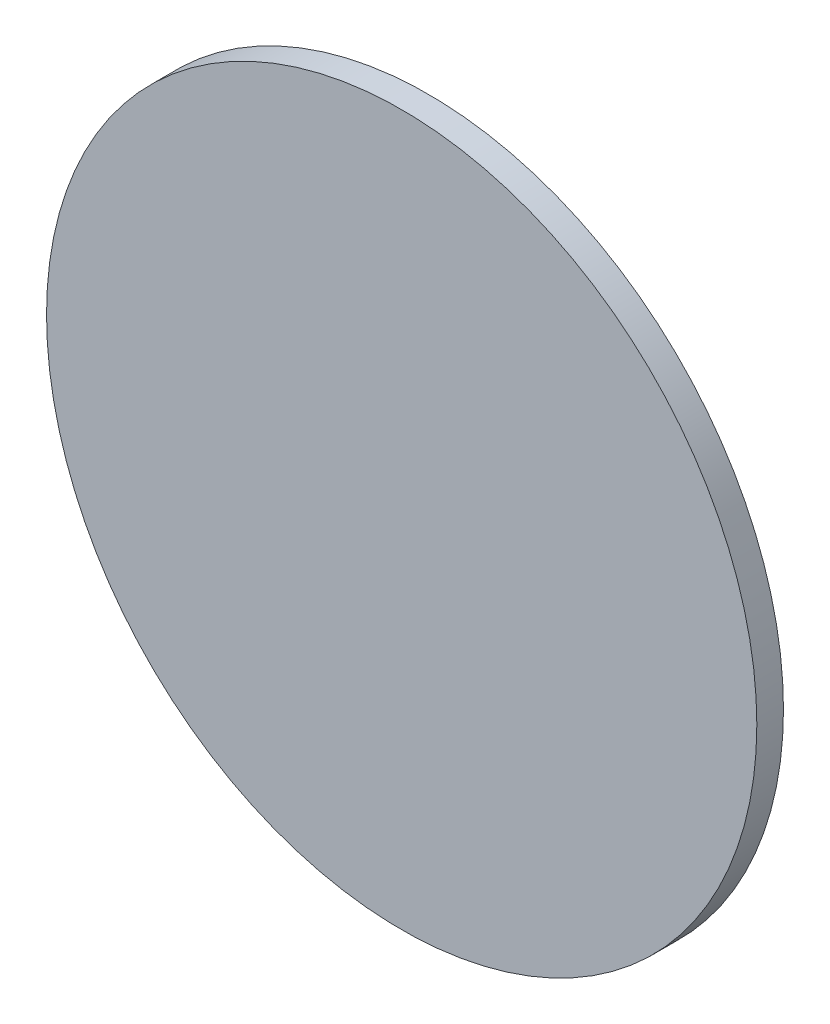
ISO-10303-21;
HEADER;
FILE_DESCRIPTION(('STEP AP214'),'2;1');
FILE_NAME('part.step','',(''),(''),'','','');
FILE_SCHEMA(('AUTOMOTIVE_DESIGN { 1 0 10303 214 1 1 1 1 }'));
ENDSEC;
DATA;
#1=APPLICATION_CONTEXT('core data for automotive mechanical design processes');
#2=APPLICATION_PROTOCOL_DEFINITION('international standard','automotive_design',2000,#1);
#3=PRODUCT_CONTEXT('',#1,'mechanical');
#4=PRODUCT('Part','Part','',(#3));
#5=PRODUCT_RELATED_PRODUCT_CATEGORY('part','',(#4));
#6=PRODUCT_DEFINITION_FORMATION('','',#4);
#7=PRODUCT_DEFINITION_CONTEXT('part definition',#1,'design');
#8=PRODUCT_DEFINITION('design','',#6,#7);
#9=PRODUCT_DEFINITION_SHAPE('','',#8);
#10=(LENGTH_UNIT() NAMED_UNIT(*) SI_UNIT(.MILLI.,.METRE.));
#11=(NAMED_UNIT(*) PLANE_ANGLE_UNIT() SI_UNIT($,.RADIAN.));
#12=(NAMED_UNIT(*) SI_UNIT($,.STERADIAN.) SOLID_ANGLE_UNIT());
#13=UNCERTAINTY_MEASURE_WITH_UNIT(LENGTH_MEASURE(1.E-05),#10,'distance_accuracy_value','');
#14=(GEOMETRIC_REPRESENTATION_CONTEXT(3) GLOBAL_UNCERTAINTY_ASSIGNED_CONTEXT((#13)) GLOBAL_UNIT_ASSIGNED_CONTEXT((#10,
#11,#12)) REPRESENTATION_CONTEXT('',''));
#15=CARTESIAN_POINT('',(0.,0.,0.));
#16=DIRECTION('',(0.,0.,1.));
#17=DIRECTION('',(1.,0.,0.));
#18=AXIS2_PLACEMENT_3D('',#15,#16,#17);
#19=CARTESIAN_POINT('',(0.,0.,-0.3));
#20=DIRECTION('',(0.,0.,1.));
#21=DIRECTION('',(1.,0.,0.));
#22=AXIS2_PLACEMENT_3D('',#19,#20,#21);
#23=CYLINDRICAL_SURFACE('',#22,4.);
#24=CARTESIAN_POINT('',(0.,0.,-0.3));
#25=DIRECTION('',(0.,0.,1.));
#26=DIRECTION('',(1.,0.,0.));
#27=AXIS2_PLACEMENT_3D('',#24,#25,#26);
#28=CIRCLE('',#27,4.);
#29=CARTESIAN_POINT('',(4.,0.,-0.3));
#30=VERTEX_POINT('',#29);
#31=EDGE_CURVE('E10',#30,#30,#28,.T.);
#32=ORIENTED_EDGE('',*,*,#31,.T.);
#33=EDGE_LOOP('',(#32));
#34=FACE_BOUND('',#33,.T.);
#35=CARTESIAN_POINT('',(0.,0.,0.));
#36=DIRECTION('',(0.,0.,1.));
#37=DIRECTION('',(1.,0.,0.));
#38=AXIS2_PLACEMENT_3D('',#35,#36,#37);
#39=CIRCLE('',#38,4.);
#40=CARTESIAN_POINT('',(4.,0.,0.));
#41=VERTEX_POINT('',#40);
#42=EDGE_CURVE('E34',#41,#41,#39,.T.);
#43=ORIENTED_EDGE('',*,*,#42,.F.);
#44=EDGE_LOOP('',(#43));
#45=FACE_BOUND('',#44,.T.);
#46=ADVANCED_FACE('F31',(#34,#45),#23,.T.);
#47=CARTESIAN_POINT('',(0.,0.,-0.3));
#48=DIRECTION('',(0.,0.,1.));
#49=DIRECTION('',(1.,0.,0.));
#50=AXIS2_PLACEMENT_3D('',#47,#48,#49);
#51=PLANE('',#50);
#52=ORIENTED_EDGE('',*,*,#31,.F.);
#53=EDGE_LOOP('',(#52));
#54=FACE_BOUND('',#53,.T.);
#55=ADVANCED_FACE('F46',(#54),#51,.F.);
#56=CARTESIAN_POINT('',(0.,0.,0.));
#57=DIRECTION('',(0.,0.,1.));
#58=DIRECTION('',(1.,0.,0.));
#59=AXIS2_PLACEMENT_3D('',#56,#57,#58);
#60=PLANE('',#59);
#61=ORIENTED_EDGE('',*,*,#42,.T.);
#62=EDGE_LOOP('',(#61));
#63=FACE_BOUND('',#62,.T.);
#64=ADVANCED_FACE('F43',(#63),#60,.T.);
#65=CLOSED_SHELL('',(#46,#55,#64));
#66=MANIFOLD_SOLID_BREP('B2',#65);
#67=ADVANCED_BREP_SHAPE_REPRESENTATION('',(#18,#66),#14);
#68=SHAPE_DEFINITION_REPRESENTATION(#9,#67);
ENDSEC;
END-ISO-10303-21;
